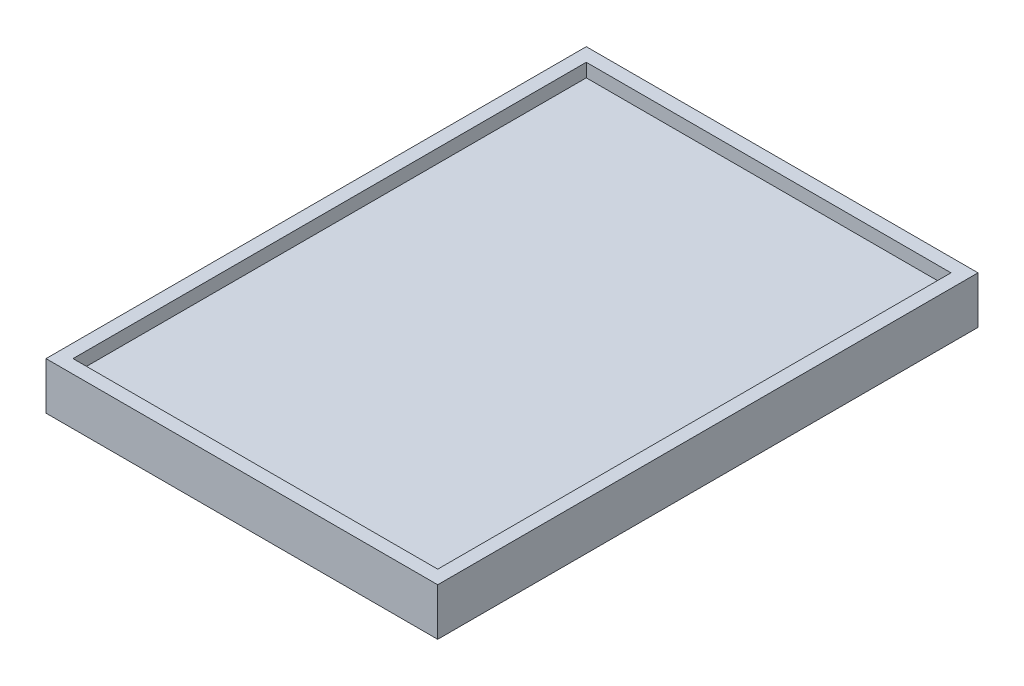
ISO-10303-21;
HEADER;
FILE_DESCRIPTION(('STEP AP214'),'2;1');
FILE_NAME('part.step','',(''),(''),'','','');
FILE_SCHEMA(('AUTOMOTIVE_DESIGN { 1 0 10303 214 1 1 1 1 }'));
ENDSEC;
DATA;
#1=APPLICATION_CONTEXT('core data for automotive mechanical design processes');
#2=APPLICATION_PROTOCOL_DEFINITION('international standard','automotive_design',2000,#1);
#3=PRODUCT_CONTEXT('',#1,'mechanical');
#4=PRODUCT('Part','Part','',(#3));
#5=PRODUCT_RELATED_PRODUCT_CATEGORY('part','',(#4));
#6=PRODUCT_DEFINITION_FORMATION('','',#4);
#7=PRODUCT_DEFINITION_CONTEXT('part definition',#1,'design');
#8=PRODUCT_DEFINITION('design','',#6,#7);
#9=PRODUCT_DEFINITION_SHAPE('','',#8);
#10=(LENGTH_UNIT() NAMED_UNIT(*) SI_UNIT(.MILLI.,.METRE.));
#11=(NAMED_UNIT(*) PLANE_ANGLE_UNIT() SI_UNIT($,.RADIAN.));
#12=(NAMED_UNIT(*) SI_UNIT($,.STERADIAN.) SOLID_ANGLE_UNIT());
#13=UNCERTAINTY_MEASURE_WITH_UNIT(LENGTH_MEASURE(1.E-05),#10,'distance_accuracy_value','');
#14=(GEOMETRIC_REPRESENTATION_CONTEXT(3) GLOBAL_UNCERTAINTY_ASSIGNED_CONTEXT((#13)) GLOBAL_UNIT_ASSIGNED_CONTEXT((#10,
#11,#12)) REPRESENTATION_CONTEXT('',''));
#15=CARTESIAN_POINT('',(0.,0.,0.));
#16=DIRECTION('',(0.,0.,1.));
#17=DIRECTION('',(1.,0.,0.));
#18=AXIS2_PLACEMENT_3D('',#15,#16,#17);
#19=CARTESIAN_POINT('',(145.,35.,-200.));
#20=DIRECTION('',(-1.,0.,0.));
#21=DIRECTION('',(0.,0.,1.));
#22=AXIS2_PLACEMENT_3D('',#19,#20,#21);
#23=PLANE('',#22);
#24=DIRECTION('',(0.,0.,-1.));
#25=VECTOR('',#24,1.);
#26=CARTESIAN_POINT('',(145.,0.,-200.));
#27=LINE('',#26,#25);
#28=CARTESIAN_POINT('',(145.,0.,200.));
#29=VERTEX_POINT('',#28);
#30=CARTESIAN_POINT('',(145.,0.,-200.));
#31=VERTEX_POINT('',#30);
#32=EDGE_CURVE('E141',#29,#31,#27,.T.);
#33=ORIENTED_EDGE('',*,*,#32,.T.);
#34=DIRECTION('',(0.,-1.,0.));
#35=VECTOR('',#34,1.);
#36=CARTESIAN_POINT('',(145.,35.,-200.));
#37=LINE('',#36,#35);
#38=CARTESIAN_POINT('',(145.,35.,-200.));
#39=VERTEX_POINT('',#38);
#40=EDGE_CURVE('E11',#39,#31,#37,.T.);
#41=ORIENTED_EDGE('',*,*,#40,.F.);
#42=DIRECTION('',(0.,0.,-1.));
#43=VECTOR('',#42,1.);
#44=CARTESIAN_POINT('',(145.,35.,-200.));
#45=LINE('',#44,#43);
#46=CARTESIAN_POINT('',(145.,35.,200.));
#47=VERTEX_POINT('',#46);
#48=EDGE_CURVE('E145',#47,#39,#45,.T.);
#49=ORIENTED_EDGE('',*,*,#48,.F.);
#50=DIRECTION('',(0.,-1.,0.));
#51=VECTOR('',#50,1.);
#52=CARTESIAN_POINT('',(145.,35.,200.));
#53=LINE('',#52,#51);
#54=EDGE_CURVE('E151',#47,#29,#53,.T.);
#55=ORIENTED_EDGE('',*,*,#54,.T.);
#56=EDGE_LOOP('',(#33,#41,#49,#55));
#57=FACE_BOUND('',#56,.T.);
#58=ADVANCED_FACE('F33',(#57),#23,.F.);
#59=CARTESIAN_POINT('',(-145.,35.,-200.));
#60=DIRECTION('',(0.,0.,1.));
#61=DIRECTION('',(1.,0.,0.));
#62=AXIS2_PLACEMENT_3D('',#59,#60,#61);
#63=PLANE('',#62);
#64=DIRECTION('',(-1.,0.,0.));
#65=VECTOR('',#64,1.);
#66=CARTESIAN_POINT('',(-145.,0.,-200.));
#67=LINE('',#66,#65);
#68=CARTESIAN_POINT('',(-145.,0.,-200.));
#69=VERTEX_POINT('',#68);
#70=EDGE_CURVE('E154',#31,#69,#67,.T.);
#71=ORIENTED_EDGE('',*,*,#70,.T.);
#72=DIRECTION('',(0.,-1.,0.));
#73=VECTOR('',#72,1.);
#74=CARTESIAN_POINT('',(-145.,35.,-200.));
#75=LINE('',#74,#73);
#76=CARTESIAN_POINT('',(-145.,35.,-200.));
#77=VERTEX_POINT('',#76);
#78=EDGE_CURVE('E40',#77,#69,#75,.T.);
#79=ORIENTED_EDGE('',*,*,#78,.F.);
#80=DIRECTION('',(-1.,0.,0.));
#81=VECTOR('',#80,1.);
#82=CARTESIAN_POINT('',(-145.,35.,-200.));
#83=LINE('',#82,#81);
#84=EDGE_CURVE('E84',#39,#77,#83,.T.);
#85=ORIENTED_EDGE('',*,*,#84,.F.);
#86=ORIENTED_EDGE('',*,*,#40,.T.);
#87=EDGE_LOOP('',(#71,#79,#85,#86));
#88=FACE_BOUND('',#87,.T.);
#89=ADVANCED_FACE('F183',(#88),#63,.F.);
#90=CARTESIAN_POINT('',(-145.,35.,-200.));
#91=DIRECTION('',(1.,0.,0.));
#92=DIRECTION('',(0.,0.,-1.));
#93=AXIS2_PLACEMENT_3D('',#90,#91,#92);
#94=PLANE('',#93);
#95=DIRECTION('',(0.,0.,1.));
#96=VECTOR('',#95,1.);
#97=CARTESIAN_POINT('',(-145.,0.,-200.));
#98=LINE('',#97,#96);
#99=CARTESIAN_POINT('',(-145.,0.,200.));
#100=VERTEX_POINT('',#99);
#101=EDGE_CURVE('E156',#69,#100,#98,.T.);
#102=ORIENTED_EDGE('',*,*,#101,.T.);
#103=DIRECTION('',(0.,-1.,0.));
#104=VECTOR('',#103,1.);
#105=CARTESIAN_POINT('',(-145.,35.,200.));
#106=LINE('',#105,#104);
#107=CARTESIAN_POINT('',(-145.,35.,200.));
#108=VERTEX_POINT('',#107);
#109=EDGE_CURVE('E160',#108,#100,#106,.T.);
#110=ORIENTED_EDGE('',*,*,#109,.F.);
#111=DIRECTION('',(0.,0.,1.));
#112=VECTOR('',#111,1.);
#113=CARTESIAN_POINT('',(-145.,35.,-200.));
#114=LINE('',#113,#112);
#115=EDGE_CURVE('E148',#77,#108,#114,.T.);
#116=ORIENTED_EDGE('',*,*,#115,.F.);
#117=ORIENTED_EDGE('',*,*,#78,.T.);
#118=EDGE_LOOP('',(#102,#110,#116,#117));
#119=FACE_BOUND('',#118,.T.);
#120=ADVANCED_FACE('F165',(#119),#94,.F.);
#121=CARTESIAN_POINT('',(-145.,35.,200.));
#122=DIRECTION('',(0.,0.,-1.));
#123=DIRECTION('',(-1.,0.,0.));
#124=AXIS2_PLACEMENT_3D('',#121,#122,#123);
#125=PLANE('',#124);
#126=DIRECTION('',(1.,0.,0.));
#127=VECTOR('',#126,1.);
#128=CARTESIAN_POINT('',(-145.,0.,200.));
#129=LINE('',#128,#127);
#130=EDGE_CURVE('E77',#100,#29,#129,.T.);
#131=ORIENTED_EDGE('',*,*,#130,.T.);
#132=ORIENTED_EDGE('',*,*,#54,.F.);
#133=DIRECTION('',(1.,0.,0.));
#134=VECTOR('',#133,1.);
#135=CARTESIAN_POINT('',(-145.,35.,200.));
#136=LINE('',#135,#134);
#137=EDGE_CURVE('E56',#108,#47,#136,.T.);
#138=ORIENTED_EDGE('',*,*,#137,.F.);
#139=ORIENTED_EDGE('',*,*,#109,.T.);
#140=EDGE_LOOP('',(#131,#132,#138,#139));
#141=FACE_BOUND('',#140,.T.);
#142=ADVANCED_FACE('F173',(#141),#125,.F.);
#143=CARTESIAN_POINT('',(0.,35.,0.));
#144=DIRECTION('',(0.,1.,0.));
#145=DIRECTION('',(0.,0.,1.));
#146=AXIS2_PLACEMENT_3D('',#143,#144,#145);
#147=PLANE('',#146);
#148=DIRECTION('',(1.,0.,0.));
#149=VECTOR('',#148,1.);
#150=CARTESIAN_POINT('',(-135.,35.,190.));
#151=LINE('',#150,#149);
#152=CARTESIAN_POINT('',(-135.,35.,190.));
#153=VERTEX_POINT('',#152);
#154=CARTESIAN_POINT('',(135.,35.,190.));
#155=VERTEX_POINT('',#154);
#156=EDGE_CURVE('E47',#153,#155,#151,.T.);
#157=ORIENTED_EDGE('',*,*,#156,.F.);
#158=DIRECTION('',(0.,0.,1.));
#159=VECTOR('',#158,1.);
#160=CARTESIAN_POINT('',(-135.,35.,-190.));
#161=LINE('',#160,#159);
#162=CARTESIAN_POINT('',(-135.,35.,-190.));
#163=VERTEX_POINT('',#162);
#164=EDGE_CURVE('E126',#163,#153,#161,.T.);
#165=ORIENTED_EDGE('',*,*,#164,.F.);
#166=DIRECTION('',(-1.,0.,0.));
#167=VECTOR('',#166,1.);
#168=CARTESIAN_POINT('',(135.,35.,-190.));
#169=LINE('',#168,#167);
#170=CARTESIAN_POINT('',(135.,35.,-190.));
#171=VERTEX_POINT('',#170);
#172=EDGE_CURVE('E129',#171,#163,#169,.T.);
#173=ORIENTED_EDGE('',*,*,#172,.F.);
#174=DIRECTION('',(0.,0.,-1.));
#175=VECTOR('',#174,1.);
#176=CARTESIAN_POINT('',(135.,35.,190.));
#177=LINE('',#176,#175);
#178=EDGE_CURVE('E135',#155,#171,#177,.T.);
#179=ORIENTED_EDGE('',*,*,#178,.F.);
#180=EDGE_LOOP('',(#157,#165,#173,#179));
#181=FACE_BOUND('',#180,.T.);
#182=ORIENTED_EDGE('',*,*,#48,.T.);
#183=ORIENTED_EDGE('',*,*,#84,.T.);
#184=ORIENTED_EDGE('',*,*,#115,.T.);
#185=ORIENTED_EDGE('',*,*,#137,.T.);
#186=EDGE_LOOP('',(#182,#183,#184,#185));
#187=FACE_BOUND('',#186,.T.);
#188=ADVANCED_FACE('F175',(#181,#187),#147,.T.);
#189=CARTESIAN_POINT('',(0.,0.,0.));
#190=DIRECTION('',(0.,1.,0.));
#191=DIRECTION('',(0.,0.,1.));
#192=AXIS2_PLACEMENT_3D('',#189,#190,#191);
#193=PLANE('',#192);
#194=ORIENTED_EDGE('',*,*,#32,.F.);
#195=ORIENTED_EDGE('',*,*,#130,.F.);
#196=ORIENTED_EDGE('',*,*,#101,.F.);
#197=ORIENTED_EDGE('',*,*,#70,.F.);
#198=EDGE_LOOP('',(#194,#195,#196,#197));
#199=FACE_BOUND('',#198,.T.);
#200=ADVANCED_FACE('F169',(#199),#193,.F.);
#201=CARTESIAN_POINT('',(-135.,25.,190.));
#202=DIRECTION('',(0.,0.,1.));
#203=DIRECTION('',(1.,0.,0.));
#204=AXIS2_PLACEMENT_3D('',#201,#202,#203);
#205=PLANE('',#204);
#206=ORIENTED_EDGE('',*,*,#156,.T.);
#207=DIRECTION('',(0.,1.,0.));
#208=VECTOR('',#207,1.);
#209=CARTESIAN_POINT('',(135.,25.,190.));
#210=LINE('',#209,#208);
#211=CARTESIAN_POINT('',(135.,25.,190.));
#212=VERTEX_POINT('',#211);
#213=EDGE_CURVE('E104',#212,#155,#210,.T.);
#214=ORIENTED_EDGE('',*,*,#213,.F.);
#215=DIRECTION('',(1.,0.,0.));
#216=VECTOR('',#215,1.);
#217=CARTESIAN_POINT('',(-135.,25.,190.));
#218=LINE('',#217,#216);
#219=CARTESIAN_POINT('',(-135.,25.,190.));
#220=VERTEX_POINT('',#219);
#221=EDGE_CURVE('E108',#220,#212,#218,.T.);
#222=ORIENTED_EDGE('',*,*,#221,.F.);
#223=DIRECTION('',(0.,1.,0.));
#224=VECTOR('',#223,1.);
#225=CARTESIAN_POINT('',(-135.,25.,190.));
#226=LINE('',#225,#224);
#227=EDGE_CURVE('E139',#220,#153,#226,.T.);
#228=ORIENTED_EDGE('',*,*,#227,.T.);
#229=EDGE_LOOP('',(#206,#214,#222,#228));
#230=FACE_BOUND('',#229,.T.);
#231=ADVANCED_FACE('F106',(#230),#205,.F.);
#232=CARTESIAN_POINT('',(-135.,25.,-190.));
#233=DIRECTION('',(-1.,0.,0.));
#234=DIRECTION('',(0.,0.,1.));
#235=AXIS2_PLACEMENT_3D('',#232,#233,#234);
#236=PLANE('',#235);
#237=ORIENTED_EDGE('',*,*,#164,.T.);
#238=ORIENTED_EDGE('',*,*,#227,.F.);
#239=DIRECTION('',(0.,0.,1.));
#240=VECTOR('',#239,1.);
#241=CARTESIAN_POINT('',(-135.,25.,-190.));
#242=LINE('',#241,#240);
#243=CARTESIAN_POINT('',(-135.,25.,-190.));
#244=VERTEX_POINT('',#243);
#245=EDGE_CURVE('E114',#244,#220,#242,.T.);
#246=ORIENTED_EDGE('',*,*,#245,.F.);
#247=DIRECTION('',(0.,1.,0.));
#248=VECTOR('',#247,1.);
#249=CARTESIAN_POINT('',(-135.,25.,-190.));
#250=LINE('',#249,#248);
#251=EDGE_CURVE('E142',#244,#163,#250,.T.);
#252=ORIENTED_EDGE('',*,*,#251,.T.);
#253=EDGE_LOOP('',(#237,#238,#246,#252));
#254=FACE_BOUND('',#253,.T.);
#255=ADVANCED_FACE('F222',(#254),#236,.F.);
#256=CARTESIAN_POINT('',(135.,25.,-190.));
#257=DIRECTION('',(0.,0.,-1.));
#258=DIRECTION('',(-1.,0.,0.));
#259=AXIS2_PLACEMENT_3D('',#256,#257,#258);
#260=PLANE('',#259);
#261=ORIENTED_EDGE('',*,*,#172,.T.);
#262=ORIENTED_EDGE('',*,*,#251,.F.);
#263=DIRECTION('',(-1.,0.,0.));
#264=VECTOR('',#263,1.);
#265=CARTESIAN_POINT('',(135.,25.,-190.));
#266=LINE('',#265,#264);
#267=CARTESIAN_POINT('',(135.,25.,-190.));
#268=VERTEX_POINT('',#267);
#269=EDGE_CURVE('E122',#268,#244,#266,.T.);
#270=ORIENTED_EDGE('',*,*,#269,.F.);
#271=DIRECTION('',(0.,1.,0.));
#272=VECTOR('',#271,1.);
#273=CARTESIAN_POINT('',(135.,25.,-190.));
#274=LINE('',#273,#272);
#275=EDGE_CURVE('E113',#268,#171,#274,.T.);
#276=ORIENTED_EDGE('',*,*,#275,.T.);
#277=EDGE_LOOP('',(#261,#262,#270,#276));
#278=FACE_BOUND('',#277,.T.);
#279=ADVANCED_FACE('F231',(#278),#260,.F.);
#280=CARTESIAN_POINT('',(135.,25.,190.));
#281=DIRECTION('',(1.,0.,0.));
#282=DIRECTION('',(0.,0.,-1.));
#283=AXIS2_PLACEMENT_3D('',#280,#281,#282);
#284=PLANE('',#283);
#285=ORIENTED_EDGE('',*,*,#178,.T.);
#286=ORIENTED_EDGE('',*,*,#275,.F.);
#287=DIRECTION('',(0.,0.,-1.));
#288=VECTOR('',#287,1.);
#289=CARTESIAN_POINT('',(135.,25.,190.));
#290=LINE('',#289,#288);
#291=EDGE_CURVE('E117',#212,#268,#290,.T.);
#292=ORIENTED_EDGE('',*,*,#291,.F.);
#293=ORIENTED_EDGE('',*,*,#213,.T.);
#294=EDGE_LOOP('',(#285,#286,#292,#293));
#295=FACE_BOUND('',#294,.T.);
#296=ADVANCED_FACE('F118',(#295),#284,.F.);
#297=CARTESIAN_POINT('',(0.,25.,0.));
#298=DIRECTION('',(0.,1.,0.));
#299=DIRECTION('',(0.,0.,1.));
#300=AXIS2_PLACEMENT_3D('',#297,#298,#299);
#301=PLANE('',#300);
#302=ORIENTED_EDGE('',*,*,#221,.T.);
#303=ORIENTED_EDGE('',*,*,#291,.T.);
#304=ORIENTED_EDGE('',*,*,#269,.T.);
#305=ORIENTED_EDGE('',*,*,#245,.T.);
#306=EDGE_LOOP('',(#302,#303,#304,#305));
#307=FACE_BOUND('',#306,.T.);
#308=ADVANCED_FACE('F124',(#307),#301,.T.);
#309=CLOSED_SHELL('',(#58,#89,#120,#142,#188,#200,#231,#255,#279,#296,#308));
#310=MANIFOLD_SOLID_BREP('B2',#309);
#311=ADVANCED_BREP_SHAPE_REPRESENTATION('',(#18,#310),#14);
#312=SHAPE_DEFINITION_REPRESENTATION(#9,#311);
ENDSEC;
END-ISO-10303-21;
